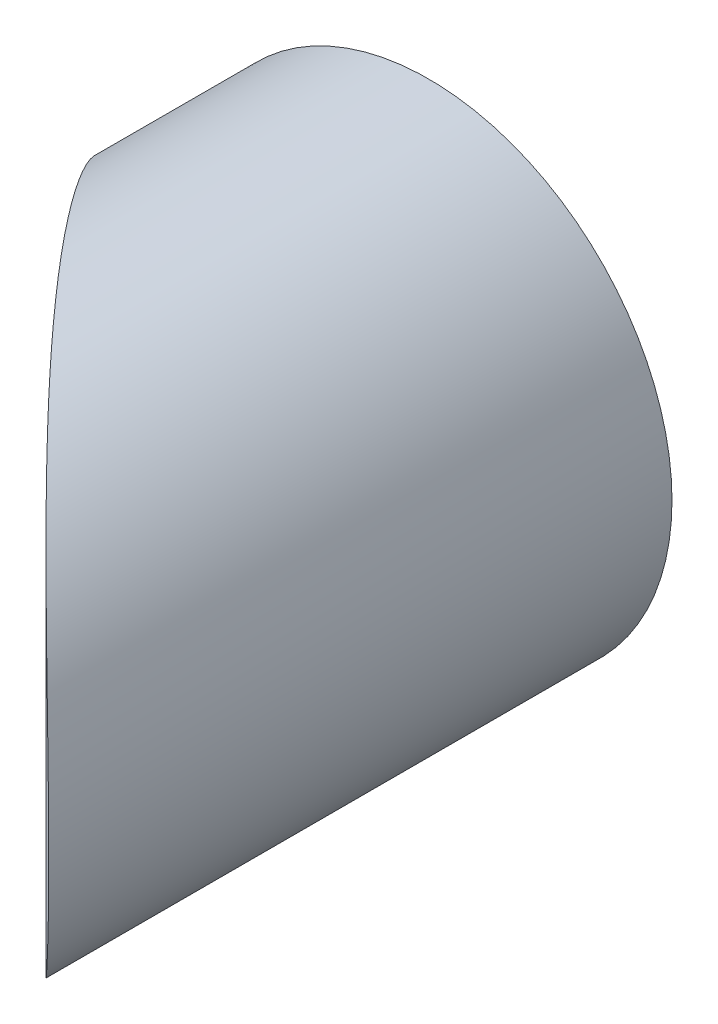
ISO-10303-21;
HEADER;
FILE_DESCRIPTION(('STEP AP214'),'2;1');
FILE_NAME('part.step','',(''),(''),'','','');
FILE_SCHEMA(('AUTOMOTIVE_DESIGN { 1 0 10303 214 1 1 1 1 }'));
ENDSEC;
DATA;
#1=APPLICATION_CONTEXT('core data for automotive mechanical design processes');
#2=APPLICATION_PROTOCOL_DEFINITION('international standard','automotive_design',2000,#1);
#3=PRODUCT_CONTEXT('',#1,'mechanical');
#4=PRODUCT('Part','Part','',(#3));
#5=PRODUCT_RELATED_PRODUCT_CATEGORY('part','',(#4));
#6=PRODUCT_DEFINITION_FORMATION('','',#4);
#7=PRODUCT_DEFINITION_CONTEXT('part definition',#1,'design');
#8=PRODUCT_DEFINITION('design','',#6,#7);
#9=PRODUCT_DEFINITION_SHAPE('','',#8);
#10=(LENGTH_UNIT() NAMED_UNIT(*) SI_UNIT(.MILLI.,.METRE.));
#11=(NAMED_UNIT(*) PLANE_ANGLE_UNIT() SI_UNIT($,.RADIAN.));
#12=(NAMED_UNIT(*) SI_UNIT($,.STERADIAN.) SOLID_ANGLE_UNIT());
#13=UNCERTAINTY_MEASURE_WITH_UNIT(LENGTH_MEASURE(1.E-05),#10,'distance_accuracy_value','');
#14=(GEOMETRIC_REPRESENTATION_CONTEXT(3) GLOBAL_UNCERTAINTY_ASSIGNED_CONTEXT((#13)) GLOBAL_UNIT_ASSIGNED_CONTEXT((#10,
#11,#12)) REPRESENTATION_CONTEXT('',''));
#15=CARTESIAN_POINT('',(0.,0.,0.));
#16=DIRECTION('',(0.,0.,1.));
#17=DIRECTION('',(1.,0.,0.));
#18=AXIS2_PLACEMENT_3D('',#15,#16,#17);
#19=CARTESIAN_POINT('',(0.,0.,16.2040796624066));
#20=DIRECTION('',(0.,0.,-1.));
#21=DIRECTION('',(-1.,0.,0.));
#22=AXIS2_PLACEMENT_3D('',#19,#20,#21);
#23=CYLINDRICAL_SURFACE('',#22,3.175);
#24=CARTESIAN_POINT('',(0.,0.,0.));
#25=DIRECTION('',(0.,0.,1.));
#26=DIRECTION('',(1.,0.,0.));
#27=AXIS2_PLACEMENT_3D('',#24,#25,#26);
#28=CIRCLE('',#27,3.175);
#29=CARTESIAN_POINT('',(3.175,0.,0.));
#30=VERTEX_POINT('',#29);
#31=EDGE_CURVE('E48',#30,#30,#28,.T.);
#32=ORIENTED_EDGE('',*,*,#31,.T.);
#33=EDGE_LOOP('',(#32));
#34=FACE_BOUND('',#33,.T.);
#35=CARTESIAN_POINT('',(-3.175,0.,0.849789156856608));
#36=CARTESIAN_POINT('',(-3.17500034723759,-0.0642820746058976,0.849788653615678));
#37=CARTESIAN_POINT('',(-3.17304236646819,-0.128563092493175,0.852554720346834));
#38=CARTESIAN_POINT('',(-3.16527455650453,-0.256454551074554,0.863521010596438));
#39=CARTESIAN_POINT('',(-3.15946263250355,-0.320064607955327,0.871724189450243));
#40=CARTESIAN_POINT('',(-3.14415115233393,-0.44606414369632,0.893311693586108));
#41=CARTESIAN_POINT('',(-3.13464477293713,-0.50845113843987,0.906705605417973));
#42=CARTESIAN_POINT('',(-3.11221506785442,-0.631391894179892,0.938260780585011));
#43=CARTESIAN_POINT('',(-3.09928971109201,-0.691944541554578,0.956424877648507));
#44=CARTESIAN_POINT('',(-3.0562272886186,-0.868705338787142,1.01682914539346));
#45=CARTESIAN_POINT('',(-3.02157965204208,-0.981742384585055,1.0652994091719));
#46=CARTESIAN_POINT('',(-2.94275124824539,-1.1975366112387,1.1750192239047));
#47=CARTESIAN_POINT('',(-2.89856798735835,-1.30029109278711,1.23627211751356));
#48=CARTESIAN_POINT('',(-2.77304947837379,-1.55624874818123,1.40925741684869));
#49=CARTESIAN_POINT('',(-2.68565703568282,-1.7012618883691,1.52875163123802));
#50=CARTESIAN_POINT('',(-2.54470409593607,-1.90045910495703,1.71933851605906));
#51=CARTESIAN_POINT('',(-2.49597369458168,-1.96390745164621,1.7848938361293));
#52=CARTESIAN_POINT('',(-2.39567550457845,-2.0850761388062,1.91906832151945));
#53=CARTESIAN_POINT('',(-2.34410838898559,-2.14279782898389,1.98768675934335));
#54=CARTESIAN_POINT('',(-2.20693263890799,-2.2858166498898,2.16916023953921));
#55=CARTESIAN_POINT('',(-2.11943586191182,-2.36692027776801,2.2838921036631));
#56=CARTESIAN_POINT('',(-1.9394423431502,-2.51652192191733,2.51761212561494));
#57=CARTESIAN_POINT('',(-1.84694268714385,-2.58501248634232,2.63660275027393));
#58=CARTESIAN_POINT('',(-1.65775067727942,-2.71023296821278,2.87754487071317));
#59=CARTESIAN_POINT('',(-1.56105519899943,-2.766953933188,2.99949854212563));
#60=CARTESIAN_POINT('',(-1.36419936704295,-2.86912499861681,3.24524793377006));
#61=CARTESIAN_POINT('',(-1.26403965425516,-2.91457717123949,3.36904331089419));
#62=CARTESIAN_POINT('',(-1.05573056388256,-2.99653060805477,3.62385608735501));
#63=CARTESIAN_POINT('',(-0.947430897831068,-3.03247895257993,3.75492821445023));
#64=CARTESIAN_POINT('',(-0.728081984832749,-3.09248280894339,4.01750640310978));
#65=CARTESIAN_POINT('',(-0.617032493055524,-3.1165372577832,4.14901250240276));
#66=CARTESIAN_POINT('',(-0.392725395643469,-3.1526643667533,4.41173414564204));
#67=CARTESIAN_POINT('',(-0.279468335018277,-3.16473994698893,4.54294975261631));
#68=CARTESIAN_POINT('',(-0.05126040600728,-3.17664148768825,4.80445421787226));
#69=CARTESIAN_POINT('',(0.0636903219579117,-3.17646845802413,4.93474315167037));
#70=CARTESIAN_POINT('',(0.289295892812171,-3.1637152906057,5.18767306126264));
#71=CARTESIAN_POINT('',(0.399900904334504,-3.1517144679109,5.31038722325911));
#72=CARTESIAN_POINT('',(0.621492793880345,-3.11560193654123,5.55371695066035));
#73=CARTESIAN_POINT('',(0.732479709647295,-3.09148899457484,5.67433230106372));
#74=CARTESIAN_POINT('',(0.953953407931057,-3.03047501681084,5.91258799832923));
#75=CARTESIAN_POINT('',(1.0644405540075,-2.99358565307245,6.03023095576798));
#76=CARTESIAN_POINT('',(1.28396594862426,-2.90620136865458,6.26167270568106));
#77=CARTESIAN_POINT('',(1.3930047564094,-2.85571186968377,6.37547300973272));
#78=CARTESIAN_POINT('',(1.65075428386022,-2.71746917440677,6.64191172159105));
#79=CARTESIAN_POINT('',(1.79825007188922,-2.62286758581621,6.79227558009746));
#80=CARTESIAN_POINT('',(2.08323447500751,-2.40272470918081,7.07924981750631));
#81=CARTESIAN_POINT('',(2.22073730880015,-2.27722854259812,7.21587984841157));
#82=CARTESIAN_POINT('',(2.44838178365872,-2.02670871208362,7.43967551863803));
#83=CARTESIAN_POINT('',(2.54204559081639,-1.90855216366481,7.53090781926502));
#84=CARTESIAN_POINT('',(2.71525684347214,-1.65280590699024,7.69844401158153));
#85=CARTESIAN_POINT('',(2.79482203161272,-1.51524102098582,7.77476667912696));
#86=CARTESIAN_POINT('',(2.92215559314916,-1.24872863340294,7.89626043569728));
#87=CARTESIAN_POINT('',(2.97307254062452,-1.12272795236778,7.94456953674535));
#88=CARTESIAN_POINT('',(3.05919045560036,-0.860779846805977,8.02602492365608));
#89=CARTESIAN_POINT('',(3.09440012859273,-0.724837980764709,8.0591796088494));
#90=CARTESIAN_POINT('',(3.1467858933368,-0.445673637004254,8.10843396933194));
#91=CARTESIAN_POINT('',(3.16386395027607,-0.302415925922769,8.12444093373241));
#92=CARTESIAN_POINT('',(3.17824542639108,-0.0140468157114492,8.1379238575235));
#93=CARTESIAN_POINT('',(3.17555454664643,0.131064036948875,8.13540515945092));
#94=CARTESIAN_POINT('',(3.15178398712802,0.405078087516505,8.11310929074439));
#95=CARTESIAN_POINT('',(3.13238209759073,0.534264049726675,8.09490672454065));
#96=CARTESIAN_POINT('',(3.07872111715503,0.786605685588665,8.04441078017445));
#97=CARTESIAN_POINT('',(3.04446083337125,0.9097608741846,8.0121162706588));
#98=CARTESIAN_POINT('',(2.96134406124782,1.15247958536016,7.93344324387932));
#99=CARTESIAN_POINT('',(2.91193969990712,1.27168061388039,7.88653475793495));
#100=CARTESIAN_POINT('',(2.80164538691622,1.4991397503694,7.7812520807523));
#101=CARTESIAN_POINT('',(2.74074914956648,1.60739181959011,7.72287161397158));
#102=CARTESIAN_POINT('',(2.57795113621366,1.86210624460605,7.56582751193988));
#103=CARTESIAN_POINT('',(2.47052290730766,2.00150097482911,7.46139250386447));
#104=CARTESIAN_POINT('',(2.24221029196735,2.25439450694027,7.23703685945662));
#105=CARTESIAN_POINT('',(2.1212961597169,2.36783431007614,7.11708189374855));
#106=CARTESIAN_POINT('',(1.82228011909737,2.60957678208892,6.81694562964224));
#107=CARTESIAN_POINT('',(1.64023143853553,2.72649045577842,6.631490169681));
#108=CARTESIAN_POINT('',(1.36201981051576,2.8699203519293,6.34311599519679));
#109=CARTESIAN_POINT('',(1.26832079650628,2.91243585618405,6.24517998888951));
#110=CARTESIAN_POINT('',(1.07987888606051,2.98743348608785,6.04650562599464));
#111=CARTESIAN_POINT('',(0.985136254344084,3.01991809808091,5.94576797060728));
#112=CARTESIAN_POINT('',(0.761712866913983,3.08518187126394,5.70610497298454));
#113=CARTESIAN_POINT('',(0.632865622770047,3.11401171767528,5.56626007679661));
#114=CARTESIAN_POINT('',(0.375658962669978,3.15538842599315,5.28370971716415));
#115=CARTESIAN_POINT('',(0.247299735677545,3.16792951656574,5.14100325800323));
#116=CARTESIAN_POINT('',(-0.00815687723674645,3.17756579483488,4.85352983648494));
#117=CARTESIAN_POINT('',(-0.135251710415582,3.17463435448822,4.7087597498143));
#118=CARTESIAN_POINT('',(-0.387139066979025,3.15384159757932,4.41834226706682));
#119=CARTESIAN_POINT('',(-0.511931906742111,3.13598234850907,4.27269499525271));
#120=CARTESIAN_POINT('',(-0.760687785599913,3.08518667657314,3.97885116063572));
#121=CARTESIAN_POINT('',(-0.884598141428385,3.05199202846122,3.83065456224469));
#122=CARTESIAN_POINT('',(-1.12862970430005,2.97041726054648,3.53523929197986));
#123=CARTESIAN_POINT('',(-1.24874987292537,2.92203301824942,3.38802089668254));
#124=CARTESIAN_POINT('',(-1.48406845928663,2.80982567166465,3.09617140165688));
#125=CARTESIAN_POINT('',(-1.59927843864911,2.74604149596725,2.9515347503775));
#126=CARTESIAN_POINT('',(-1.82402006444487,2.60218506747202,2.66612532659928));
#127=CARTESIAN_POINT('',(-1.9335558163828,2.52212480353047,2.52534979615047));
#128=CARTESIAN_POINT('',(-2.1509752236159,2.33988676499119,2.24283016323259));
#129=CARTESIAN_POINT('',(-2.25850296741954,2.23680386223941,2.10138901704615));
#130=CARTESIAN_POINT('',(-2.4634417099583,2.00886904915362,1.82890216006871));
#131=CARTESIAN_POINT('',(-2.56086074865662,1.88403465393234,1.6978482077197));
#132=CARTESIAN_POINT('',(-2.72147330080443,1.64027828210716,1.4797401511298));
#133=CARTESIAN_POINT('',(-2.78746268440247,1.52620154720443,1.38937850938759));
#134=CARTESIAN_POINT('',(-2.9078157098686,1.28205490034766,1.22354170560648));
#135=CARTESIAN_POINT('',(-2.96219957209736,1.15201343717758,1.14804066998491));
#136=CARTESIAN_POINT('',(-3.04205709598028,0.915125867578184,1.03666869066238));
#137=CARTESIAN_POINT('',(-3.07136058459837,0.812022043140196,0.995622879425699));
#138=CARTESIAN_POINT('',(-3.11986234306578,0.599097729546128,0.927533337766207));
#139=CARTESIAN_POINT('',(-3.13908449734997,0.489293810074019,0.900456514889728));
#140=CARTESIAN_POINT('',(-3.159913330144,0.315440755318206,0.871087939925592));
#141=CARTESIAN_POINT('',(-3.16555244708596,0.252776590825243,0.863128693743344));
#142=CARTESIAN_POINT('',(-3.1730961536465,0.126741408632743,0.852478784506624));
#143=CARTESIAN_POINT('',(-3.17499965768821,0.0633701908409909,0.849789652958732));
#144=CARTESIAN_POINT('',(-3.175,0.,0.849789156856608));
#145=B_SPLINE_CURVE_WITH_KNOTS('',3,(#35,#36,#37,#38,#39,#40,#41,#42,#43,#44,#45,#46,#47,#48,
#49,#50,#51,#52,#53,#54,#55,#56,#57,#58,#59,#60,#61,#62,#63,#64,#65,#66,#67,#68,#69,#70,#71,#72,
#73,#74,#75,#76,#77,#78,#79,#80,#81,#82,#83,#84,#85,#86,#87,#88,#89,#90,#91,#92,#93,#94,#95,#96,
#97,#98,#99,#100,#101,#102,#103,#104,#105,#106,#107,#108,#109,#110,#111,#112,#113,#114,#115,
#116,#117,#118,#119,#120,#121,#122,#123,#124,#125,#126,#127,#128,#129,#130,#131,#132,#133,#134,
#135,#136,#137,#138,#139,#140,#141,#142,#143,#144),.UNSPECIFIED.,.T.,.F.,(4,2,2,2,2,2,2,2,2,2,2,
2,2,2,2,2,2,2,2,2,2,2,2,2,2,2,2,2,2,2,2,2,2,2,2,2,2,2,2,2,2,2,2,2,2,2,2,2,2,2,2,2,2,2,4),(0.,
0.19275652979674,0.385617918174768,0.578837204861603,0.77217153412445,1.15361071523899,
1.53514976787458,2.15309126352611,2.46324298107222,2.77332142490928,3.26914126869537,
3.76525311150119,4.26174094635301,4.75813741639354,5.27904941372595,5.80000795835023,
6.32083947696053,6.84162805415501,7.33811568543388,7.83465388079101,8.3307396488279,
8.82662794367235,9.51702324673789,10.2064161495778,10.7332415292326,11.2593991337948,
11.6903247175538,12.1210111704516,12.5540146000366,12.9868931625059,13.3807896699778,
13.7747178067345,14.1850320248254,14.5955713259889,15.2060554805042,15.817913851062,
16.6678253525402,17.0937143300918,17.5194976582104,18.0956843181081,18.6720750733543,
19.2494581133851,19.8267611994808,20.4141608620839,21.0017200844633,21.5878093208956,
22.1734684020468,22.7883856779861,23.4028100687836,23.8807645062906,24.3578792766426,
24.7010015942908,25.0433072807926,25.2332742350417,25.4232963859128),.UNSPECIFIED.);
#146=CARTESIAN_POINT('',(-3.175,0.,0.849789156856608));
#147=VERTEX_POINT('',#146);
#148=EDGE_CURVE('E10',#147,#147,#145,.T.);
#149=ORIENTED_EDGE('',*,*,#148,.F.);
#150=EDGE_LOOP('',(#149));
#151=FACE_BOUND('',#150,.T.);
#152=ADVANCED_FACE('F37',(#34,#151),#23,.T.);
#153=CARTESIAN_POINT('',(0.,0.,0.));
#154=DIRECTION('',(0.,0.,1.));
#155=DIRECTION('',(1.,0.,0.));
#156=AXIS2_PLACEMENT_3D('',#153,#154,#155);
#157=PLANE('',#156);
#158=ORIENTED_EDGE('',*,*,#31,.F.);
#159=EDGE_LOOP('',(#158));
#160=FACE_BOUND('',#159,.T.);
#161=ADVANCED_FACE('F56',(#160),#157,.F.);
#162=CARTESIAN_POINT('',(36.0000000000004,-23.0572202538755,-26.8868179716299));
#163=DIRECTION('',(0.,1.,0.));
#164=DIRECTION('',(-1.,0.,0.));
#165=AXIS2_PLACEMENT_3D('',#162,#163,#164);
#166=CYLINDRICAL_SURFACE('',#165,48.0000000000004);
#167=ORIENTED_EDGE('',*,*,#148,.T.);
#168=EDGE_LOOP('',(#167));
#169=FACE_BOUND('',#168,.T.);
#170=ADVANCED_FACE('F58',(#169),#166,.T.);
#171=CLOSED_SHELL('',(#152,#161,#170));
#172=MANIFOLD_SOLID_BREP('B2',#171);
#173=ADVANCED_BREP_SHAPE_REPRESENTATION('',(#18,#172),#14);
#174=SHAPE_DEFINITION_REPRESENTATION(#9,#173);
ENDSEC;
END-ISO-10303-21;
